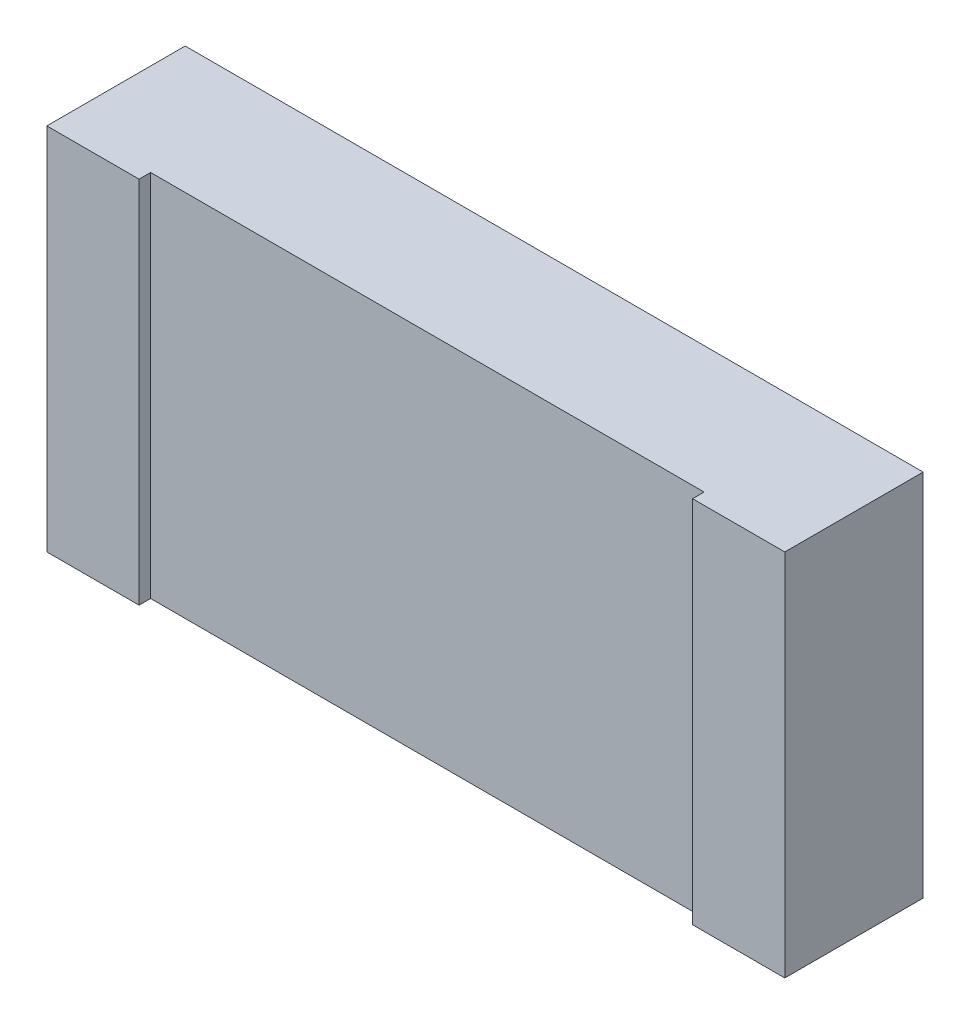
ISO-10303-21;
HEADER;
FILE_DESCRIPTION(('STEP AP214'),'2;1');
FILE_NAME('part.step','',(''),(''),'','','');
FILE_SCHEMA(('AUTOMOTIVE_DESIGN { 1 0 10303 214 1 1 1 1 }'));
ENDSEC;
DATA;
#1=APPLICATION_CONTEXT('core data for automotive mechanical design processes');
#2=APPLICATION_PROTOCOL_DEFINITION('international standard','automotive_design',2000,#1);
#3=PRODUCT_CONTEXT('',#1,'mechanical');
#4=PRODUCT('Part','Part','',(#3));
#5=PRODUCT_RELATED_PRODUCT_CATEGORY('part','',(#4));
#6=PRODUCT_DEFINITION_FORMATION('','',#4);
#7=PRODUCT_DEFINITION_CONTEXT('part definition',#1,'design');
#8=PRODUCT_DEFINITION('design','',#6,#7);
#9=PRODUCT_DEFINITION_SHAPE('','',#8);
#10=(LENGTH_UNIT() NAMED_UNIT(*) SI_UNIT(.MILLI.,.METRE.));
#11=(NAMED_UNIT(*) PLANE_ANGLE_UNIT() SI_UNIT($,.RADIAN.));
#12=(NAMED_UNIT(*) SI_UNIT($,.STERADIAN.) SOLID_ANGLE_UNIT());
#13=UNCERTAINTY_MEASURE_WITH_UNIT(LENGTH_MEASURE(1.E-05),#10,'distance_accuracy_value','');
#14=(GEOMETRIC_REPRESENTATION_CONTEXT(3) GLOBAL_UNCERTAINTY_ASSIGNED_CONTEXT((#13)) GLOBAL_UNIT_ASSIGNED_CONTEXT((#10,
#11,#12)) REPRESENTATION_CONTEXT('',''));
#15=CARTESIAN_POINT('',(0.,0.,0.));
#16=DIRECTION('',(0.,0.,1.));
#17=DIRECTION('',(1.,0.,0.));
#18=AXIS2_PLACEMENT_3D('',#15,#16,#17);
#19=CARTESIAN_POINT('',(2.45720573738,9.393496464349,0.6));
#20=DIRECTION('',(0.999999999999985,1.74845553135498E-07,0.));
#21=DIRECTION('',(0.,0.,-1.));
#22=AXIS2_PLACEMENT_3D('',#19,#20,#21);
#23=PLANE('',#22);
#24=DIRECTION('',(-1.74845552999998E-07,0.999999999999985,0.));
#25=VECTOR('',#24,1.);
#26=CARTESIAN_POINT('',(2.457206017132,7.793496464349,0.));
#27=LINE('',#26,#25);
#28=CARTESIAN_POINT('',(2.457206017132,7.793496464349,0.));
#29=VERTEX_POINT('',#28);
#30=CARTESIAN_POINT('',(2.45720573738,9.393496464349,0.));
#31=VERTEX_POINT('',#30);
#32=EDGE_CURVE('E11',#29,#31,#27,.T.);
#33=ORIENTED_EDGE('',*,*,#32,.F.);
#34=DIRECTION('',(0.,0.,1.));
#35=VECTOR('',#34,1.);
#36=CARTESIAN_POINT('',(2.457206017132,7.793496464349,0.));
#37=LINE('',#36,#35);
#38=CARTESIAN_POINT('',(2.457206017132,7.793496464349,0.6));
#39=VERTEX_POINT('',#38);
#40=EDGE_CURVE('E184',#29,#39,#37,.T.);
#41=ORIENTED_EDGE('',*,*,#40,.T.);
#42=DIRECTION('',(-1.74845553138797E-07,0.999999999999985,0.));
#43=VECTOR('',#42,1.);
#44=CARTESIAN_POINT('',(2.457206017132,7.793496464349,0.6));
#45=LINE('',#44,#43);
#46=CARTESIAN_POINT('',(2.45720573738,9.393496464349,0.6));
#47=VERTEX_POINT('',#46);
#48=EDGE_CURVE('E141',#39,#47,#45,.T.);
#49=ORIENTED_EDGE('',*,*,#48,.T.);
#50=DIRECTION('',(0.,0.,1.));
#51=VECTOR('',#50,1.);
#52=CARTESIAN_POINT('',(2.45720573738,9.393496464349,0.));
#53=LINE('',#52,#51);
#54=EDGE_CURVE('E159',#31,#47,#53,.T.);
#55=ORIENTED_EDGE('',*,*,#54,.F.);
#56=EDGE_LOOP('',(#33,#41,#49,#55));
#57=FACE_BOUND('',#56,.T.);
#58=ADVANCED_FACE('F17',(#57),#23,.F.);
#59=CARTESIAN_POINT('',(2.457206017132,7.793496464349,0.));
#60=DIRECTION('',(0.,0.,1.));
#61=DIRECTION('',(1.,0.,0.));
#62=AXIS2_PLACEMENT_3D('',#59,#60,#61);
#63=PLANE('',#62);
#64=ORIENTED_EDGE('',*,*,#32,.T.);
#65=DIRECTION('',(0.999999999999985,1.74845552999998E-07,0.));
#66=VECTOR('',#65,1.);
#67=CARTESIAN_POINT('',(2.45720573738,9.393496464349,0.));
#68=LINE('',#67,#66);
#69=CARTESIAN_POINT('',(5.65720573738,9.393497023855,0.));
#70=VERTEX_POINT('',#69);
#71=EDGE_CURVE('E111',#31,#70,#68,.T.);
#72=ORIENTED_EDGE('',*,*,#71,.T.);
#73=DIRECTION('',(1.74845552999998E-07,-0.999999999999985,0.));
#74=VECTOR('',#73,1.);
#75=CARTESIAN_POINT('',(5.65720573738,9.393497023855,0.));
#76=LINE('',#75,#74);
#77=CARTESIAN_POINT('',(5.657206017132,7.793497023855,0.));
#78=VERTEX_POINT('',#77);
#79=EDGE_CURVE('E125',#70,#78,#76,.T.);
#80=ORIENTED_EDGE('',*,*,#79,.T.);
#81=DIRECTION('',(-0.999999999999985,-1.74845552999998E-07,0.));
#82=VECTOR('',#81,1.);
#83=CARTESIAN_POINT('',(5.657206017132,7.793497023855,0.));
#84=LINE('',#83,#82);
#85=EDGE_CURVE('E27',#78,#29,#84,.T.);
#86=ORIENTED_EDGE('',*,*,#85,.T.);
#87=EDGE_LOOP('',(#64,#72,#80,#86));
#88=FACE_BOUND('',#87,.T.);
#89=ADVANCED_FACE('F207',(#88),#63,.F.);
#90=CARTESIAN_POINT('',(2.457206017132,7.793496464349,0.6));
#91=DIRECTION('',(-1.74845552999998E-07,0.999999999999985,0.));
#92=DIRECTION('',(0.,0.,1.));
#93=AXIS2_PLACEMENT_3D('',#90,#91,#92);
#94=PLANE('',#93);
#95=DIRECTION('',(-0.999999999999985,-1.74845552999998E-07,0.));
#96=VECTOR('',#95,1.);
#97=CARTESIAN_POINT('',(5.657206017132,7.793497023855,0.6));
#98=LINE('',#97,#96);
#99=CARTESIAN_POINT('',(5.657206017132,7.793497023855,0.6));
#100=VERTEX_POINT('',#99);
#101=CARTESIAN_POINT('',(5.257206017132,7.793496953917,0.6));
#102=VERTEX_POINT('',#101);
#103=EDGE_CURVE('E116',#100,#102,#98,.T.);
#104=ORIENTED_EDGE('',*,*,#103,.T.);
#105=DIRECTION('',(0.,0.,-1.));
#106=VECTOR('',#105,1.);
#107=CARTESIAN_POINT('',(5.257206017132,7.793496953917,0.6));
#108=LINE('',#107,#106);
#109=CARTESIAN_POINT('',(5.257206017132,7.793496953917,0.55));
#110=VERTEX_POINT('',#109);
#111=EDGE_CURVE('E138',#102,#110,#108,.T.);
#112=ORIENTED_EDGE('',*,*,#111,.T.);
#113=DIRECTION('',(-0.999999999999985,-1.74845552999998E-07,0.));
#114=VECTOR('',#113,1.);
#115=CARTESIAN_POINT('',(5.257206017132,7.793496953917,0.55));
#116=LINE('',#115,#114);
#117=CARTESIAN_POINT('',(2.857206017132,7.793496534287,0.55));
#118=VERTEX_POINT('',#117);
#119=EDGE_CURVE('E148',#110,#118,#116,.T.);
#120=ORIENTED_EDGE('',*,*,#119,.T.);
#121=DIRECTION('',(0.,0.,-1.));
#122=VECTOR('',#121,1.);
#123=CARTESIAN_POINT('',(2.857206017132,7.793496534287,0.6));
#124=LINE('',#123,#122);
#125=CARTESIAN_POINT('',(2.857206017132,7.793496534287,0.6));
#126=VERTEX_POINT('',#125);
#127=EDGE_CURVE('E165',#126,#118,#124,.T.);
#128=ORIENTED_EDGE('',*,*,#127,.F.);
#129=DIRECTION('',(-0.999999999999985,-1.74845552999998E-07,0.));
#130=VECTOR('',#129,1.);
#131=CARTESIAN_POINT('',(2.857206017132,7.793496534287,0.6));
#132=LINE('',#131,#130);
#133=EDGE_CURVE('E143',#126,#39,#132,.T.);
#134=ORIENTED_EDGE('',*,*,#133,.T.);
#135=ORIENTED_EDGE('',*,*,#40,.F.);
#136=ORIENTED_EDGE('',*,*,#85,.F.);
#137=DIRECTION('',(0.,0.,1.));
#138=VECTOR('',#137,1.);
#139=CARTESIAN_POINT('',(5.657206017132,7.793497023855,0.));
#140=LINE('',#139,#138);
#141=EDGE_CURVE('E121',#78,#100,#140,.T.);
#142=ORIENTED_EDGE('',*,*,#141,.T.);
#143=EDGE_LOOP('',(#104,#112,#120,#128,#134,#135,#136,#142));
#144=FACE_BOUND('',#143,.T.);
#145=ADVANCED_FACE('F180',(#144),#94,.F.);
#146=CARTESIAN_POINT('',(2.457206017132,7.793496464349,0.6));
#147=DIRECTION('',(0.,0.,1.));
#148=DIRECTION('',(1.,0.,0.));
#149=AXIS2_PLACEMENT_3D('',#146,#147,#148);
#150=PLANE('',#149);
#151=DIRECTION('',(1.74845552999998E-07,-0.999999999999985,0.));
#152=VECTOR('',#151,1.);
#153=CARTESIAN_POINT('',(5.25720573738,9.393496953917,0.6));
#154=LINE('',#153,#152);
#155=CARTESIAN_POINT('',(5.25720573738,9.393496953917,0.6));
#156=VERTEX_POINT('',#155);
#157=EDGE_CURVE('E20',#156,#102,#154,.T.);
#158=ORIENTED_EDGE('',*,*,#157,.T.);
#159=ORIENTED_EDGE('',*,*,#103,.F.);
#160=DIRECTION('',(1.74845553138797E-07,-0.999999999999985,0.));
#161=VECTOR('',#160,1.);
#162=CARTESIAN_POINT('',(5.65720573738,9.393497023855,0.6));
#163=LINE('',#162,#161);
#164=CARTESIAN_POINT('',(5.65720573738,9.393497023855,0.6));
#165=VERTEX_POINT('',#164);
#166=EDGE_CURVE('E114',#165,#100,#163,.T.);
#167=ORIENTED_EDGE('',*,*,#166,.F.);
#168=DIRECTION('',(0.999999999999985,1.74845552999998E-07,0.));
#169=VECTOR('',#168,1.);
#170=CARTESIAN_POINT('',(5.25720573738,9.393496953917,0.6));
#171=LINE('',#170,#169);
#172=EDGE_CURVE('E98',#156,#165,#171,.T.);
#173=ORIENTED_EDGE('',*,*,#172,.F.);
#174=EDGE_LOOP('',(#158,#159,#167,#173));
#175=FACE_BOUND('',#174,.T.);
#176=ADVANCED_FACE('F115',(#175),#150,.T.);
#177=CARTESIAN_POINT('',(5.25720573738,9.393496953917,0.55));
#178=DIRECTION('',(0.999999999999985,1.74845553135498E-07,0.));
#179=DIRECTION('',(0.,0.,-1.));
#180=AXIS2_PLACEMENT_3D('',#177,#178,#179);
#181=PLANE('',#180);
#182=ORIENTED_EDGE('',*,*,#157,.F.);
#183=DIRECTION('',(0.,0.,-1.));
#184=VECTOR('',#183,1.);
#185=CARTESIAN_POINT('',(5.25720573738,9.393496953917,0.6));
#186=LINE('',#185,#184);
#187=CARTESIAN_POINT('',(5.25720573738,9.393496953917,0.55));
#188=VERTEX_POINT('',#187);
#189=EDGE_CURVE('E107',#156,#188,#186,.T.);
#190=ORIENTED_EDGE('',*,*,#189,.T.);
#191=DIRECTION('',(1.74845553138797E-07,-0.999999999999985,0.));
#192=VECTOR('',#191,1.);
#193=CARTESIAN_POINT('',(5.25720573738,9.393496953917,0.55));
#194=LINE('',#193,#192);
#195=EDGE_CURVE('E151',#188,#110,#194,.T.);
#196=ORIENTED_EDGE('',*,*,#195,.T.);
#197=ORIENTED_EDGE('',*,*,#111,.F.);
#198=EDGE_LOOP('',(#182,#190,#196,#197));
#199=FACE_BOUND('',#198,.T.);
#200=ADVANCED_FACE('F172',(#199),#181,.F.);
#201=CARTESIAN_POINT('',(5.257206017132,7.793496953917,0.55));
#202=DIRECTION('',(0.,0.,1.));
#203=DIRECTION('',(1.,0.,0.));
#204=AXIS2_PLACEMENT_3D('',#201,#202,#203);
#205=PLANE('',#204);
#206=ORIENTED_EDGE('',*,*,#195,.F.);
#207=DIRECTION('',(0.999999999999985,1.74845552953697E-07,0.));
#208=VECTOR('',#207,1.);
#209=CARTESIAN_POINT('',(2.85720573738,9.393496534287,0.55));
#210=LINE('',#209,#208);
#211=CARTESIAN_POINT('',(2.85720573738,9.393496534287,0.55));
#212=VERTEX_POINT('',#211);
#213=EDGE_CURVE('E135',#212,#188,#210,.T.);
#214=ORIENTED_EDGE('',*,*,#213,.F.);
#215=DIRECTION('',(-1.74845553277598E-07,0.999999999999985,0.));
#216=VECTOR('',#215,1.);
#217=CARTESIAN_POINT('',(2.857206017132,7.793496534287,0.55));
#218=LINE('',#217,#216);
#219=EDGE_CURVE('E163',#118,#212,#218,.T.);
#220=ORIENTED_EDGE('',*,*,#219,.F.);
#221=ORIENTED_EDGE('',*,*,#119,.F.);
#222=EDGE_LOOP('',(#206,#214,#220,#221));
#223=FACE_BOUND('',#222,.T.);
#224=ADVANCED_FACE('F176',(#223),#205,.T.);
#225=CARTESIAN_POINT('',(2.85720573738,9.393496534287,0.55));
#226=DIRECTION('',(-0.999999999999985,-1.74845553271098E-07,0.));
#227=DIRECTION('',(-1.74845553271098E-07,0.999999999999985,0.));
#228=AXIS2_PLACEMENT_3D('',#225,#226,#227);
#229=PLANE('',#228);
#230=DIRECTION('',(-1.74845552999998E-07,0.999999999999985,0.));
#231=VECTOR('',#230,1.);
#232=CARTESIAN_POINT('',(2.857206017132,7.793496534287,0.6));
#233=LINE('',#232,#231);
#234=CARTESIAN_POINT('',(2.85720573738,9.393496534287,0.6));
#235=VERTEX_POINT('',#234);
#236=EDGE_CURVE('E144',#126,#235,#233,.T.);
#237=ORIENTED_EDGE('',*,*,#236,.F.);
#238=ORIENTED_EDGE('',*,*,#127,.T.);
#239=ORIENTED_EDGE('',*,*,#219,.T.);
#240=DIRECTION('',(0.,0.,-1.));
#241=VECTOR('',#240,1.);
#242=CARTESIAN_POINT('',(2.85720573738,9.393496534287,0.6));
#243=LINE('',#242,#241);
#244=EDGE_CURVE('E154',#235,#212,#243,.T.);
#245=ORIENTED_EDGE('',*,*,#244,.F.);
#246=EDGE_LOOP('',(#237,#238,#239,#245));
#247=FACE_BOUND('',#246,.T.);
#248=ADVANCED_FACE('F241',(#247),#229,.F.);
#249=CARTESIAN_POINT('',(2.457206017132,7.793496464349,0.6));
#250=DIRECTION('',(0.,0.,1.));
#251=DIRECTION('',(1.,0.,0.));
#252=AXIS2_PLACEMENT_3D('',#249,#250,#251);
#253=PLANE('',#252);
#254=ORIENTED_EDGE('',*,*,#236,.T.);
#255=DIRECTION('',(0.999999999999985,1.74845552999998E-07,0.));
#256=VECTOR('',#255,1.);
#257=CARTESIAN_POINT('',(2.45720573738,9.393496464349,0.6));
#258=LINE('',#257,#256);
#259=EDGE_CURVE('E158',#47,#235,#258,.T.);
#260=ORIENTED_EDGE('',*,*,#259,.F.);
#261=ORIENTED_EDGE('',*,*,#48,.F.);
#262=ORIENTED_EDGE('',*,*,#133,.F.);
#263=EDGE_LOOP('',(#254,#260,#261,#262));
#264=FACE_BOUND('',#263,.T.);
#265=ADVANCED_FACE('F211',(#264),#253,.T.);
#266=CARTESIAN_POINT('',(2.45720573738,9.393496464349,0.6));
#267=DIRECTION('',(1.74845552966098E-07,-0.999999999999985,0.));
#268=DIRECTION('',(0.,0.,-1.));
#269=AXIS2_PLACEMENT_3D('',#266,#267,#268);
#270=PLANE('',#269);
#271=ORIENTED_EDGE('',*,*,#213,.T.);
#272=ORIENTED_EDGE('',*,*,#189,.F.);
#273=ORIENTED_EDGE('',*,*,#172,.T.);
#274=DIRECTION('',(0.,0.,1.));
#275=VECTOR('',#274,1.);
#276=CARTESIAN_POINT('',(5.65720573738,9.393497023855,0.));
#277=LINE('',#276,#275);
#278=EDGE_CURVE('E104',#70,#165,#277,.T.);
#279=ORIENTED_EDGE('',*,*,#278,.F.);
#280=ORIENTED_EDGE('',*,*,#71,.F.);
#281=ORIENTED_EDGE('',*,*,#54,.T.);
#282=ORIENTED_EDGE('',*,*,#259,.T.);
#283=ORIENTED_EDGE('',*,*,#244,.T.);
#284=EDGE_LOOP('',(#271,#272,#273,#279,#280,#281,#282,#283));
#285=FACE_BOUND('',#284,.T.);
#286=ADVANCED_FACE('F101',(#285),#270,.F.);
#287=CARTESIAN_POINT('',(5.65720573738,9.393497023855,0.6));
#288=DIRECTION('',(-0.999999999999985,-1.74845553135498E-07,0.));
#289=DIRECTION('',(-1.74845553135498E-07,0.999999999999985,0.));
#290=AXIS2_PLACEMENT_3D('',#287,#288,#289);
#291=PLANE('',#290);
#292=ORIENTED_EDGE('',*,*,#79,.F.);
#293=ORIENTED_EDGE('',*,*,#278,.T.);
#294=ORIENTED_EDGE('',*,*,#166,.T.);
#295=ORIENTED_EDGE('',*,*,#141,.F.);
#296=EDGE_LOOP('',(#292,#293,#294,#295));
#297=FACE_BOUND('',#296,.T.);
#298=ADVANCED_FACE('F123',(#297),#291,.F.);
#299=CLOSED_SHELL('',(#58,#89,#145,#176,#200,#224,#248,#265,#286,#298));
#300=MANIFOLD_SOLID_BREP('B1',#299);
#301=ADVANCED_BREP_SHAPE_REPRESENTATION('',(#18,#300),#14);
#302=SHAPE_DEFINITION_REPRESENTATION(#9,#301);
ENDSEC;
END-ISO-10303-21;
